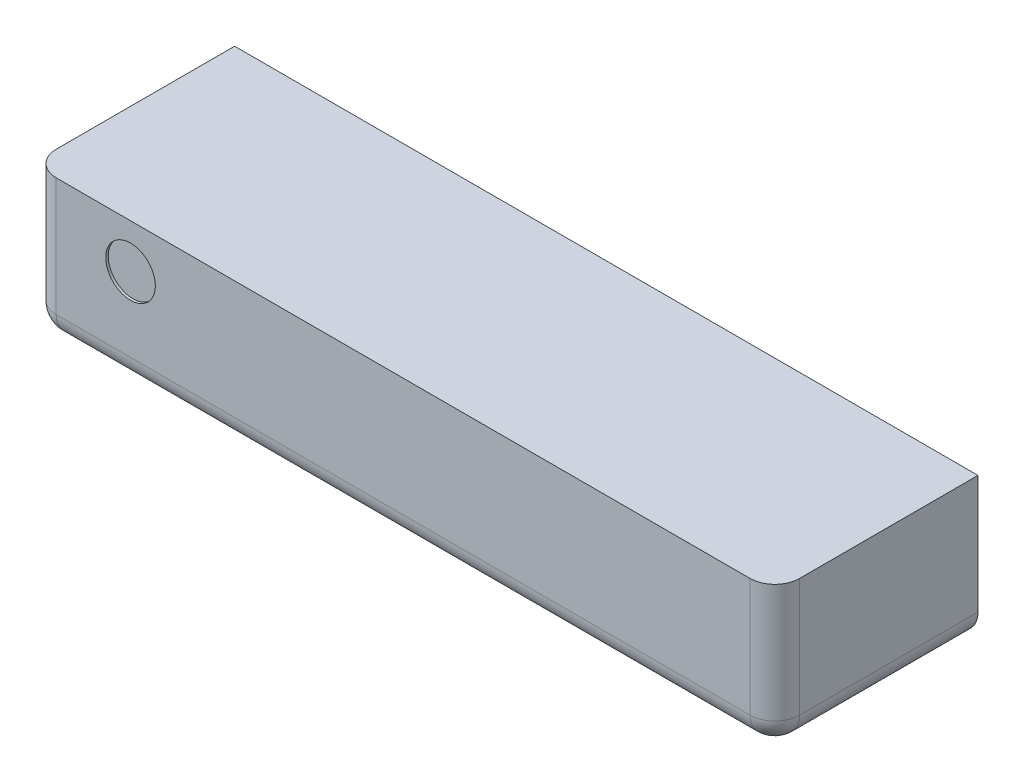
ISO-10303-21;
HEADER;
FILE_DESCRIPTION(('STEP AP214'),'2;1');
FILE_NAME('part.step','',(''),(''),'','','');
FILE_SCHEMA(('AUTOMOTIVE_DESIGN { 1 0 10303 214 1 1 1 1 }'));
ENDSEC;
DATA;
#1=APPLICATION_CONTEXT('core data for automotive mechanical design processes');
#2=APPLICATION_PROTOCOL_DEFINITION('international standard','automotive_design',2000,#1);
#3=PRODUCT_CONTEXT('',#1,'mechanical');
#4=PRODUCT('Part','Part','',(#3));
#5=PRODUCT_RELATED_PRODUCT_CATEGORY('part','',(#4));
#6=PRODUCT_DEFINITION_FORMATION('','',#4);
#7=PRODUCT_DEFINITION_CONTEXT('part definition',#1,'design');
#8=PRODUCT_DEFINITION('design','',#6,#7);
#9=PRODUCT_DEFINITION_SHAPE('','',#8);
#10=(LENGTH_UNIT() NAMED_UNIT(*) SI_UNIT(.MILLI.,.METRE.));
#11=(NAMED_UNIT(*) PLANE_ANGLE_UNIT() SI_UNIT($,.RADIAN.));
#12=(NAMED_UNIT(*) SI_UNIT($,.STERADIAN.) SOLID_ANGLE_UNIT());
#13=UNCERTAINTY_MEASURE_WITH_UNIT(LENGTH_MEASURE(1.E-05),#10,'distance_accuracy_value','');
#14=(GEOMETRIC_REPRESENTATION_CONTEXT(3) GLOBAL_UNCERTAINTY_ASSIGNED_CONTEXT((#13)) GLOBAL_UNIT_ASSIGNED_CONTEXT((#10,
#11,#12)) REPRESENTATION_CONTEXT('',''));
#15=CARTESIAN_POINT('',(0.,0.,0.));
#16=DIRECTION('',(0.,0.,1.));
#17=DIRECTION('',(1.,0.,0.));
#18=AXIS2_PLACEMENT_3D('',#15,#16,#17);
#19=CARTESIAN_POINT('',(-1.125,-1.51,0.2));
#20=DIRECTION('',(1.,0.,0.));
#21=DIRECTION('',(0.,1.,0.));
#22=AXIS2_PLACEMENT_3D('',#19,#20,#21);
#23=PLANE('',#22);
#24=DIRECTION('',(0.,1.,0.));
#25=VECTOR('',#24,1.);
#26=CARTESIAN_POINT('',(-1.125,-1.51,0.));
#27=LINE('',#26,#25);
#28=CARTESIAN_POINT('',(-1.125,-1.51,0.));
#29=VERTEX_POINT('',#28);
#30=CARTESIAN_POINT('',(-1.125,-1.26,0.));
#31=VERTEX_POINT('',#30);
#32=EDGE_CURVE('P0_E89',#29,#31,#27,.T.);
#33=ORIENTED_EDGE('',*,*,#32,.F.);
#34=DIRECTION('',(0.,0.,-1.));
#35=VECTOR('',#34,1.);
#36=CARTESIAN_POINT('',(-1.125,-1.51,0.2));
#37=LINE('',#36,#35);
#38=CARTESIAN_POINT('',(-1.125,-1.51,0.2));
#39=VERTEX_POINT('',#38);
#40=EDGE_CURVE('P0_E76',#39,#29,#37,.T.);
#41=ORIENTED_EDGE('',*,*,#40,.F.);
#42=DIRECTION('',(0.,1.,0.));
#43=VECTOR('',#42,1.);
#44=CARTESIAN_POINT('',(-1.125,-1.51,0.2));
#45=LINE('',#44,#43);
#46=CARTESIAN_POINT('',(-1.125,-1.26,0.2));
#47=VERTEX_POINT('',#46);
#48=EDGE_CURVE('P0_E99',#39,#47,#45,.T.);
#49=ORIENTED_EDGE('',*,*,#48,.T.);
#50=DIRECTION('',(0.,0.,-1.));
#51=VECTOR('',#50,1.);
#52=CARTESIAN_POINT('',(-1.125,-1.26,0.2));
#53=LINE('',#52,#51);
#54=EDGE_CURVE('P0_E11',#47,#31,#53,.T.);
#55=ORIENTED_EDGE('',*,*,#54,.T.);
#56=EDGE_LOOP('',(#33,#41,#49,#55));
#57=FACE_BOUND('',#56,.T.);
#58=ADVANCED_FACE('P0_F17',(#57),#23,.F.);
#59=CARTESIAN_POINT('',(-0.975,-1.26,0.2));
#60=DIRECTION('',(0.,0.,-1.));
#61=DIRECTION('',(-1.,0.,0.));
#62=AXIS2_PLACEMENT_3D('',#59,#60,#61);
#63=CYLINDRICAL_SURFACE('',#62,0.15);
#64=CARTESIAN_POINT('',(-0.975,-1.26,0.));
#65=DIRECTION('',(0.,0.,-1.));
#66=DIRECTION('',(1.,0.,0.));
#67=AXIS2_PLACEMENT_3D('',#64,#65,#66);
#68=CIRCLE('',#67,0.15);
#69=CARTESIAN_POINT('',(-0.825,-1.26,0.));
#70=VERTEX_POINT('',#69);
#71=EDGE_CURVE('P0_E70',#31,#70,#68,.T.);
#72=ORIENTED_EDGE('',*,*,#71,.F.);
#73=ORIENTED_EDGE('',*,*,#54,.F.);
#74=CARTESIAN_POINT('',(-0.975,-1.26,0.2));
#75=DIRECTION('',(0.,0.,-1.));
#76=DIRECTION('',(1.,0.,0.));
#77=AXIS2_PLACEMENT_3D('',#74,#75,#76);
#78=CIRCLE('',#77,0.15);
#79=CARTESIAN_POINT('',(-0.825,-1.26,0.2));
#80=VERTEX_POINT('',#79);
#81=EDGE_CURVE('P0_E73',#47,#80,#78,.T.);
#82=ORIENTED_EDGE('',*,*,#81,.T.);
#83=DIRECTION('',(0.,0.,-1.));
#84=VECTOR('',#83,1.);
#85=CARTESIAN_POINT('',(-0.825,-1.26,0.2));
#86=LINE('',#85,#84);
#87=EDGE_CURVE('P0_E27',#80,#70,#86,.T.);
#88=ORIENTED_EDGE('',*,*,#87,.T.);
#89=EDGE_LOOP('',(#72,#73,#82,#88));
#90=FACE_BOUND('',#89,.T.);
#91=ADVANCED_FACE('P0_F67',(#90),#63,.T.);
#92=CARTESIAN_POINT('',(-0.825,-1.51,0.2));
#93=DIRECTION('',(-1.,0.,0.));
#94=DIRECTION('',(0.,0.,1.));
#95=AXIS2_PLACEMENT_3D('',#92,#93,#94);
#96=PLANE('',#95);
#97=DIRECTION('',(0.,-1.,0.));
#98=VECTOR('',#97,1.);
#99=CARTESIAN_POINT('',(-0.825,-1.51,0.));
#100=LINE('',#99,#98);
#101=CARTESIAN_POINT('',(-0.825,-1.51,0.));
#102=VERTEX_POINT('',#101);
#103=EDGE_CURVE('P0_E79',#70,#102,#100,.T.);
#104=ORIENTED_EDGE('',*,*,#103,.F.);
#105=ORIENTED_EDGE('',*,*,#87,.F.);
#106=DIRECTION('',(0.,-1.,0.));
#107=VECTOR('',#106,1.);
#108=CARTESIAN_POINT('',(-0.825,-1.51,0.2));
#109=LINE('',#108,#107);
#110=CARTESIAN_POINT('',(-0.825,-1.51,0.2));
#111=VERTEX_POINT('',#110);
#112=EDGE_CURVE('P0_E109',#80,#111,#109,.T.);
#113=ORIENTED_EDGE('',*,*,#112,.T.);
#114=DIRECTION('',(0.,0.,-1.));
#115=VECTOR('',#114,1.);
#116=CARTESIAN_POINT('',(-0.825,-1.51,0.2));
#117=LINE('',#116,#115);
#118=EDGE_CURVE('P0_E20',#111,#102,#117,.T.);
#119=ORIENTED_EDGE('',*,*,#118,.T.);
#120=EDGE_LOOP('',(#104,#105,#113,#119));
#121=FACE_BOUND('',#120,.T.);
#122=ADVANCED_FACE('P0_F80',(#121),#96,.F.);
#123=CARTESIAN_POINT('',(-1.125,-1.51,0.2));
#124=DIRECTION('',(0.,1.,0.));
#125=DIRECTION('',(1.,0.,0.));
#126=AXIS2_PLACEMENT_3D('',#123,#124,#125);
#127=PLANE('',#126);
#128=DIRECTION('',(-1.,0.,0.));
#129=VECTOR('',#128,1.);
#130=CARTESIAN_POINT('',(-1.125,-1.51,0.));
#131=LINE('',#130,#129);
#132=EDGE_CURVE('P0_E85',#102,#29,#131,.T.);
#133=ORIENTED_EDGE('',*,*,#132,.F.);
#134=ORIENTED_EDGE('',*,*,#118,.F.);
#135=DIRECTION('',(-1.,0.,0.));
#136=VECTOR('',#135,1.);
#137=CARTESIAN_POINT('',(-1.125,-1.51,0.2));
#138=LINE('',#137,#136);
#139=EDGE_CURVE('P0_E105',#111,#39,#138,.T.);
#140=ORIENTED_EDGE('',*,*,#139,.T.);
#141=ORIENTED_EDGE('',*,*,#40,.T.);
#142=EDGE_LOOP('',(#133,#134,#140,#141));
#143=FACE_BOUND('',#142,.T.);
#144=ADVANCED_FACE('P0_F123',(#143),#127,.F.);
#145=CARTESIAN_POINT('',(-0.975,-1.26,0.2));
#146=DIRECTION('',(0.,0.,1.));
#147=DIRECTION('',(1.,0.,0.));
#148=AXIS2_PLACEMENT_3D('',#145,#146,#147);
#149=PLANE('',#148);
#150=ORIENTED_EDGE('',*,*,#48,.F.);
#151=ORIENTED_EDGE('',*,*,#139,.F.);
#152=ORIENTED_EDGE('',*,*,#112,.F.);
#153=ORIENTED_EDGE('',*,*,#81,.F.);
#154=EDGE_LOOP('',(#150,#151,#152,#153));
#155=FACE_BOUND('',#154,.T.);
#156=ADVANCED_FACE('P0_F128',(#155),#149,.T.);
#157=CARTESIAN_POINT('',(-0.975,-1.26,0.));
#158=DIRECTION('',(0.,0.,1.));
#159=DIRECTION('',(1.,0.,0.));
#160=AXIS2_PLACEMENT_3D('',#157,#158,#159);
#161=PLANE('',#160);
#162=ORIENTED_EDGE('',*,*,#32,.T.);
#163=ORIENTED_EDGE('',*,*,#71,.T.);
#164=ORIENTED_EDGE('',*,*,#103,.T.);
#165=ORIENTED_EDGE('',*,*,#132,.T.);
#166=EDGE_LOOP('',(#162,#163,#164,#165));
#167=FACE_BOUND('',#166,.T.);
#168=ADVANCED_FACE('P0_F87',(#167),#161,.F.);
#169=CLOSED_SHELL('',(#58,#91,#122,#144,#156,#168));
#170=MANIFOLD_SOLID_BREP('P0_B1',#169);
#171=CARTESIAN_POINT('',(-0.475,-1.51,0.2));
#172=DIRECTION('',(1.,0.,0.));
#173=DIRECTION('',(0.,1.,0.));
#174=AXIS2_PLACEMENT_3D('',#171,#172,#173);
#175=PLANE('',#174);
#176=DIRECTION('',(0.,1.,0.));
#177=VECTOR('',#176,1.);
#178=CARTESIAN_POINT('',(-0.475,-1.51,0.));
#179=LINE('',#178,#177);
#180=CARTESIAN_POINT('',(-0.475,-1.51,0.));
#181=VERTEX_POINT('',#180);
#182=CARTESIAN_POINT('',(-0.475,-1.26,0.));
#183=VERTEX_POINT('',#182);
#184=EDGE_CURVE('P1_E88',#181,#183,#179,.T.);
#185=ORIENTED_EDGE('',*,*,#184,.F.);
#186=DIRECTION('',(0.,0.,-1.));
#187=VECTOR('',#186,1.);
#188=CARTESIAN_POINT('',(-0.475,-1.51,0.2));
#189=LINE('',#188,#187);
#190=CARTESIAN_POINT('',(-0.475,-1.51,0.2));
#191=VERTEX_POINT('',#190);
#192=EDGE_CURVE('P1_E71',#191,#181,#189,.T.);
#193=ORIENTED_EDGE('',*,*,#192,.F.);
#194=DIRECTION('',(0.,1.,0.));
#195=VECTOR('',#194,1.);
#196=CARTESIAN_POINT('',(-0.475,-1.51,0.2));
#197=LINE('',#196,#195);
#198=CARTESIAN_POINT('',(-0.475,-1.26,0.2));
#199=VERTEX_POINT('',#198);
#200=EDGE_CURVE('P1_E91',#191,#199,#197,.T.);
#201=ORIENTED_EDGE('',*,*,#200,.T.);
#202=DIRECTION('',(0.,0.,-1.));
#203=VECTOR('',#202,1.);
#204=CARTESIAN_POINT('',(-0.475,-1.26,0.2));
#205=LINE('',#204,#203);
#206=EDGE_CURVE('P1_E11',#199,#183,#205,.T.);
#207=ORIENTED_EDGE('',*,*,#206,.T.);
#208=EDGE_LOOP('',(#185,#193,#201,#207));
#209=FACE_BOUND('',#208,.T.);
#210=ADVANCED_FACE('P1_F17',(#209),#175,.F.);
#211=CARTESIAN_POINT('',(-0.325,-1.26,0.2));
#212=DIRECTION('',(0.,0.,-1.));
#213=DIRECTION('',(-1.,0.,0.));
#214=AXIS2_PLACEMENT_3D('',#211,#212,#213);
#215=CYLINDRICAL_SURFACE('',#214,0.15);
#216=CARTESIAN_POINT('',(-0.325,-1.26,0.));
#217=DIRECTION('',(0.,0.,-1.));
#218=DIRECTION('',(1.,0.,0.));
#219=AXIS2_PLACEMENT_3D('',#216,#217,#218);
#220=CIRCLE('',#219,0.15);
#221=CARTESIAN_POINT('',(-0.175,-1.26,0.));
#222=VERTEX_POINT('',#221);
#223=EDGE_CURVE('P1_E95',#183,#222,#220,.T.);
#224=ORIENTED_EDGE('',*,*,#223,.F.);
#225=ORIENTED_EDGE('',*,*,#206,.F.);
#226=CARTESIAN_POINT('',(-0.325,-1.26,0.2));
#227=DIRECTION('',(0.,0.,-1.));
#228=DIRECTION('',(1.,0.,0.));
#229=AXIS2_PLACEMENT_3D('',#226,#227,#228);
#230=CIRCLE('',#229,0.15);
#231=CARTESIAN_POINT('',(-0.175,-1.26,0.2));
#232=VERTEX_POINT('',#231);
#233=EDGE_CURVE('P1_E113',#199,#232,#230,.T.);
#234=ORIENTED_EDGE('',*,*,#233,.T.);
#235=DIRECTION('',(0.,0.,-1.));
#236=VECTOR('',#235,1.);
#237=CARTESIAN_POINT('',(-0.175,-1.26,0.2));
#238=LINE('',#237,#236);
#239=EDGE_CURVE('P1_E25',#232,#222,#238,.T.);
#240=ORIENTED_EDGE('',*,*,#239,.T.);
#241=EDGE_LOOP('',(#224,#225,#234,#240));
#242=FACE_BOUND('',#241,.T.);
#243=ADVANCED_FACE('P1_F124',(#242),#215,.T.);
#244=CARTESIAN_POINT('',(-0.175,-1.51,0.2));
#245=DIRECTION('',(-1.,0.,0.));
#246=DIRECTION('',(0.,0.,1.));
#247=AXIS2_PLACEMENT_3D('',#244,#245,#246);
#248=PLANE('',#247);
#249=DIRECTION('',(0.,-1.,0.));
#250=VECTOR('',#249,1.);
#251=CARTESIAN_POINT('',(-0.175,-1.51,0.));
#252=LINE('',#251,#250);
#253=CARTESIAN_POINT('',(-0.175,-1.51,0.));
#254=VERTEX_POINT('',#253);
#255=EDGE_CURVE('P1_E89',#222,#254,#252,.T.);
#256=ORIENTED_EDGE('',*,*,#255,.F.);
#257=ORIENTED_EDGE('',*,*,#239,.F.);
#258=DIRECTION('',(0.,-1.,0.));
#259=VECTOR('',#258,1.);
#260=CARTESIAN_POINT('',(-0.175,-1.51,0.2));
#261=LINE('',#260,#259);
#262=CARTESIAN_POINT('',(-0.175,-1.51,0.2));
#263=VERTEX_POINT('',#262);
#264=EDGE_CURVE('P1_E110',#232,#263,#261,.T.);
#265=ORIENTED_EDGE('',*,*,#264,.T.);
#266=DIRECTION('',(0.,0.,-1.));
#267=VECTOR('',#266,1.);
#268=CARTESIAN_POINT('',(-0.175,-1.51,0.2));
#269=LINE('',#268,#267);
#270=EDGE_CURVE('P1_E48',#263,#254,#269,.T.);
#271=ORIENTED_EDGE('',*,*,#270,.T.);
#272=EDGE_LOOP('',(#256,#257,#265,#271));
#273=FACE_BOUND('',#272,.T.);
#274=ADVANCED_FACE('P1_F118',(#273),#248,.F.);
#275=CARTESIAN_POINT('',(-0.475,-1.51,0.2));
#276=DIRECTION('',(0.,1.,0.));
#277=DIRECTION('',(1.,0.,0.));
#278=AXIS2_PLACEMENT_3D('',#275,#276,#277);
#279=PLANE('',#278);
#280=DIRECTION('',(-1.,0.,0.));
#281=VECTOR('',#280,1.);
#282=CARTESIAN_POINT('',(-0.475,-1.51,0.));
#283=LINE('',#282,#281);
#284=EDGE_CURVE('P1_E74',#254,#181,#283,.T.);
#285=ORIENTED_EDGE('',*,*,#284,.F.);
#286=ORIENTED_EDGE('',*,*,#270,.F.);
#287=DIRECTION('',(-1.,0.,0.));
#288=VECTOR('',#287,1.);
#289=CARTESIAN_POINT('',(-0.475,-1.51,0.2));
#290=LINE('',#289,#288);
#291=EDGE_CURVE('P1_E77',#263,#191,#290,.T.);
#292=ORIENTED_EDGE('',*,*,#291,.T.);
#293=ORIENTED_EDGE('',*,*,#192,.T.);
#294=EDGE_LOOP('',(#285,#286,#292,#293));
#295=FACE_BOUND('',#294,.T.);
#296=ADVANCED_FACE('P1_F73',(#295),#279,.F.);
#297=CARTESIAN_POINT('',(-0.325,-1.26,0.2));
#298=DIRECTION('',(0.,0.,1.));
#299=DIRECTION('',(1.,0.,0.));
#300=AXIS2_PLACEMENT_3D('',#297,#298,#299);
#301=PLANE('',#300);
#302=ORIENTED_EDGE('',*,*,#200,.F.);
#303=ORIENTED_EDGE('',*,*,#291,.F.);
#304=ORIENTED_EDGE('',*,*,#264,.F.);
#305=ORIENTED_EDGE('',*,*,#233,.F.);
#306=EDGE_LOOP('',(#302,#303,#304,#305));
#307=FACE_BOUND('',#306,.T.);
#308=ADVANCED_FACE('P1_F122',(#307),#301,.T.);
#309=CARTESIAN_POINT('',(-0.325,-1.26,0.));
#310=DIRECTION('',(0.,0.,1.));
#311=DIRECTION('',(1.,0.,0.));
#312=AXIS2_PLACEMENT_3D('',#309,#310,#311);
#313=PLANE('',#312);
#314=ORIENTED_EDGE('',*,*,#184,.T.);
#315=ORIENTED_EDGE('',*,*,#223,.T.);
#316=ORIENTED_EDGE('',*,*,#255,.T.);
#317=ORIENTED_EDGE('',*,*,#284,.T.);
#318=EDGE_LOOP('',(#314,#315,#316,#317));
#319=FACE_BOUND('',#318,.T.);
#320=ADVANCED_FACE('P1_F86',(#319),#313,.F.);
#321=CLOSED_SHELL('',(#210,#243,#274,#296,#308,#320));
#322=MANIFOLD_SOLID_BREP('P1_B1',#321);
#323=CARTESIAN_POINT('',(0.475,-1.51,0.2));
#324=DIRECTION('',(-1.,0.,0.));
#325=DIRECTION('',(0.,0.,1.));
#326=AXIS2_PLACEMENT_3D('',#323,#324,#325);
#327=PLANE('',#326);
#328=DIRECTION('',(0.,1.,0.));
#329=VECTOR('',#328,1.);
#330=CARTESIAN_POINT('',(0.475,-1.51,0.));
#331=LINE('',#330,#329);
#332=CARTESIAN_POINT('',(0.475,-1.51,0.));
#333=VERTEX_POINT('',#332);
#334=CARTESIAN_POINT('',(0.475,-1.26,0.));
#335=VERTEX_POINT('',#334);
#336=EDGE_CURVE('P2_E72',#333,#335,#331,.T.);
#337=ORIENTED_EDGE('',*,*,#336,.T.);
#338=DIRECTION('',(0.,0.,-1.));
#339=VECTOR('',#338,1.);
#340=CARTESIAN_POINT('',(0.475,-1.26,0.2));
#341=LINE('',#340,#339);
#342=CARTESIAN_POINT('',(0.475,-1.26,0.2));
#343=VERTEX_POINT('',#342);
#344=EDGE_CURVE('P2_E11',#343,#335,#341,.T.);
#345=ORIENTED_EDGE('',*,*,#344,.F.);
#346=DIRECTION('',(0.,1.,0.));
#347=VECTOR('',#346,1.);
#348=CARTESIAN_POINT('',(0.475,-1.51,0.2));
#349=LINE('',#348,#347);
#350=CARTESIAN_POINT('',(0.475,-1.51,0.2));
#351=VERTEX_POINT('',#350);
#352=EDGE_CURVE('P2_E74',#351,#343,#349,.T.);
#353=ORIENTED_EDGE('',*,*,#352,.F.);
#354=DIRECTION('',(0.,0.,-1.));
#355=VECTOR('',#354,1.);
#356=CARTESIAN_POINT('',(0.475,-1.51,0.2));
#357=LINE('',#356,#355);
#358=EDGE_CURVE('P2_E68',#351,#333,#357,.T.);
#359=ORIENTED_EDGE('',*,*,#358,.T.);
#360=EDGE_LOOP('',(#337,#345,#353,#359));
#361=FACE_BOUND('',#360,.T.);
#362=ADVANCED_FACE('P2_F17',(#361),#327,.F.);
#363=CARTESIAN_POINT('',(0.325,-1.26,0.2));
#364=DIRECTION('',(0.,0.,-1.));
#365=DIRECTION('',(1.,0.,0.));
#366=AXIS2_PLACEMENT_3D('',#363,#364,#365);
#367=CYLINDRICAL_SURFACE('',#366,0.15);
#368=CARTESIAN_POINT('',(0.325,-1.26,0.));
#369=DIRECTION('',(0.,0.,1.));
#370=DIRECTION('',(-1.,0.,0.));
#371=AXIS2_PLACEMENT_3D('',#368,#369,#370);
#372=CIRCLE('',#371,0.15);
#373=CARTESIAN_POINT('',(0.175,-1.26,0.));
#374=VERTEX_POINT('',#373);
#375=EDGE_CURVE('P2_E91',#335,#374,#372,.T.);
#376=ORIENTED_EDGE('',*,*,#375,.T.);
#377=DIRECTION('',(0.,0.,-1.));
#378=VECTOR('',#377,1.);
#379=CARTESIAN_POINT('',(0.175,-1.26,0.2));
#380=LINE('',#379,#378);
#381=CARTESIAN_POINT('',(0.175,-1.26,0.2));
#382=VERTEX_POINT('',#381);
#383=EDGE_CURVE('P2_E27',#382,#374,#380,.T.);
#384=ORIENTED_EDGE('',*,*,#383,.F.);
#385=CARTESIAN_POINT('',(0.325,-1.26,0.2));
#386=DIRECTION('',(0.,0.,1.));
#387=DIRECTION('',(-1.,0.,0.));
#388=AXIS2_PLACEMENT_3D('',#385,#386,#387);
#389=CIRCLE('',#388,0.15);
#390=EDGE_CURVE('P2_E103',#343,#382,#389,.T.);
#391=ORIENTED_EDGE('',*,*,#390,.F.);
#392=ORIENTED_EDGE('',*,*,#344,.T.);
#393=EDGE_LOOP('',(#376,#384,#391,#392));
#394=FACE_BOUND('',#393,.T.);
#395=ADVANCED_FACE('P2_F19',(#394),#367,.T.);
#396=CARTESIAN_POINT('',(0.175,-1.51,0.2));
#397=DIRECTION('',(1.,0.,0.));
#398=DIRECTION('',(0.,1.,0.));
#399=AXIS2_PLACEMENT_3D('',#396,#397,#398);
#400=PLANE('',#399);
#401=DIRECTION('',(0.,-1.,0.));
#402=VECTOR('',#401,1.);
#403=CARTESIAN_POINT('',(0.175,-1.51,0.));
#404=LINE('',#403,#402);
#405=CARTESIAN_POINT('',(0.175,-1.51,0.));
#406=VERTEX_POINT('',#405);
#407=EDGE_CURVE('P2_E86',#374,#406,#404,.T.);
#408=ORIENTED_EDGE('',*,*,#407,.T.);
#409=DIRECTION('',(0.,0.,-1.));
#410=VECTOR('',#409,1.);
#411=CARTESIAN_POINT('',(0.175,-1.51,0.2));
#412=LINE('',#411,#410);
#413=CARTESIAN_POINT('',(0.175,-1.51,0.2));
#414=VERTEX_POINT('',#413);
#415=EDGE_CURVE('P2_E40',#414,#406,#412,.T.);
#416=ORIENTED_EDGE('',*,*,#415,.F.);
#417=DIRECTION('',(0.,-1.,0.));
#418=VECTOR('',#417,1.);
#419=CARTESIAN_POINT('',(0.175,-1.51,0.2));
#420=LINE('',#419,#418);
#421=EDGE_CURVE('P2_E107',#382,#414,#420,.T.);
#422=ORIENTED_EDGE('',*,*,#421,.F.);
#423=ORIENTED_EDGE('',*,*,#383,.T.);
#424=EDGE_LOOP('',(#408,#416,#422,#423));
#425=FACE_BOUND('',#424,.T.);
#426=ADVANCED_FACE('P2_F120',(#425),#400,.F.);
#427=CARTESIAN_POINT('',(0.475,-1.51,0.2));
#428=DIRECTION('',(0.,1.,0.));
#429=DIRECTION('',(1.,0.,0.));
#430=AXIS2_PLACEMENT_3D('',#427,#428,#429);
#431=PLANE('',#430);
#432=DIRECTION('',(1.,0.,0.));
#433=VECTOR('',#432,1.);
#434=CARTESIAN_POINT('',(0.475,-1.51,0.));
#435=LINE('',#434,#433);
#436=EDGE_CURVE('P2_E81',#406,#333,#435,.T.);
#437=ORIENTED_EDGE('',*,*,#436,.T.);
#438=ORIENTED_EDGE('',*,*,#358,.F.);
#439=DIRECTION('',(1.,0.,0.));
#440=VECTOR('',#439,1.);
#441=CARTESIAN_POINT('',(0.475,-1.51,0.2));
#442=LINE('',#441,#440);
#443=EDGE_CURVE('P2_E78',#414,#351,#442,.T.);
#444=ORIENTED_EDGE('',*,*,#443,.F.);
#445=ORIENTED_EDGE('',*,*,#415,.T.);
#446=EDGE_LOOP('',(#437,#438,#444,#445));
#447=FACE_BOUND('',#446,.T.);
#448=ADVANCED_FACE('P2_F82',(#447),#431,.F.);
#449=CARTESIAN_POINT('',(0.325,-1.26,0.2));
#450=DIRECTION('',(0.,0.,1.));
#451=DIRECTION('',(1.,0.,0.));
#452=AXIS2_PLACEMENT_3D('',#449,#450,#451);
#453=PLANE('',#452);
#454=ORIENTED_EDGE('',*,*,#352,.T.);
#455=ORIENTED_EDGE('',*,*,#390,.T.);
#456=ORIENTED_EDGE('',*,*,#421,.T.);
#457=ORIENTED_EDGE('',*,*,#443,.T.);
#458=EDGE_LOOP('',(#454,#455,#456,#457));
#459=FACE_BOUND('',#458,.T.);
#460=ADVANCED_FACE('P2_F118',(#459),#453,.T.);
#461=CARTESIAN_POINT('',(0.325,-1.26,0.));
#462=DIRECTION('',(0.,0.,1.));
#463=DIRECTION('',(1.,0.,0.));
#464=AXIS2_PLACEMENT_3D('',#461,#462,#463);
#465=PLANE('',#464);
#466=ORIENTED_EDGE('',*,*,#336,.F.);
#467=ORIENTED_EDGE('',*,*,#436,.F.);
#468=ORIENTED_EDGE('',*,*,#407,.F.);
#469=ORIENTED_EDGE('',*,*,#375,.F.);
#470=EDGE_LOOP('',(#466,#467,#468,#469));
#471=FACE_BOUND('',#470,.T.);
#472=ADVANCED_FACE('P2_F89',(#471),#465,.F.);
#473=CLOSED_SHELL('',(#362,#395,#426,#448,#460,#472));
#474=MANIFOLD_SOLID_BREP('P2_B1',#473);
#475=CARTESIAN_POINT('',(1.125,-1.51,0.2));
#476=DIRECTION('',(-1.,0.,0.));
#477=DIRECTION('',(0.,0.,1.));
#478=AXIS2_PLACEMENT_3D('',#475,#476,#477);
#479=PLANE('',#478);
#480=DIRECTION('',(0.,1.,0.));
#481=VECTOR('',#480,1.);
#482=CARTESIAN_POINT('',(1.125,-1.51,0.));
#483=LINE('',#482,#481);
#484=CARTESIAN_POINT('',(1.125,-1.51,0.));
#485=VERTEX_POINT('',#484);
#486=CARTESIAN_POINT('',(1.125,-1.26,0.));
#487=VERTEX_POINT('',#486);
#488=EDGE_CURVE('P3_E77',#485,#487,#483,.T.);
#489=ORIENTED_EDGE('',*,*,#488,.T.);
#490=DIRECTION('',(0.,0.,-1.));
#491=VECTOR('',#490,1.);
#492=CARTESIAN_POINT('',(1.125,-1.26,0.2));
#493=LINE('',#492,#491);
#494=CARTESIAN_POINT('',(1.125,-1.26,0.2));
#495=VERTEX_POINT('',#494);
#496=EDGE_CURVE('P3_E11',#495,#487,#493,.T.);
#497=ORIENTED_EDGE('',*,*,#496,.F.);
#498=DIRECTION('',(0.,1.,0.));
#499=VECTOR('',#498,1.);
#500=CARTESIAN_POINT('',(1.125,-1.51,0.2));
#501=LINE('',#500,#499);
#502=CARTESIAN_POINT('',(1.125,-1.51,0.2));
#503=VERTEX_POINT('',#502);
#504=EDGE_CURVE('P3_E79',#503,#495,#501,.T.);
#505=ORIENTED_EDGE('',*,*,#504,.F.);
#506=DIRECTION('',(0.,0.,-1.));
#507=VECTOR('',#506,1.);
#508=CARTESIAN_POINT('',(1.125,-1.51,0.2));
#509=LINE('',#508,#507);
#510=EDGE_CURVE('P3_E74',#503,#485,#509,.T.);
#511=ORIENTED_EDGE('',*,*,#510,.T.);
#512=EDGE_LOOP('',(#489,#497,#505,#511));
#513=FACE_BOUND('',#512,.T.);
#514=ADVANCED_FACE('P3_F17',(#513),#479,.F.);
#515=CARTESIAN_POINT('',(0.975,-1.26,0.2));
#516=DIRECTION('',(0.,0.,-1.));
#517=DIRECTION('',(1.,0.,0.));
#518=AXIS2_PLACEMENT_3D('',#515,#516,#517);
#519=CYLINDRICAL_SURFACE('',#518,0.15);
#520=CARTESIAN_POINT('',(0.975,-1.26,0.));
#521=DIRECTION('',(0.,0.,1.));
#522=DIRECTION('',(-1.,0.,0.));
#523=AXIS2_PLACEMENT_3D('',#520,#521,#522);
#524=CIRCLE('',#523,0.15);
#525=CARTESIAN_POINT('',(0.825,-1.26,0.));
#526=VERTEX_POINT('',#525);
#527=EDGE_CURVE('P3_E95',#487,#526,#524,.T.);
#528=ORIENTED_EDGE('',*,*,#527,.T.);
#529=DIRECTION('',(0.,0.,-1.));
#530=VECTOR('',#529,1.);
#531=CARTESIAN_POINT('',(0.825,-1.26,0.2));
#532=LINE('',#531,#530);
#533=CARTESIAN_POINT('',(0.825,-1.26,0.2));
#534=VERTEX_POINT('',#533);
#535=EDGE_CURVE('P3_E25',#534,#526,#532,.T.);
#536=ORIENTED_EDGE('',*,*,#535,.F.);
#537=CARTESIAN_POINT('',(0.975,-1.26,0.2));
#538=DIRECTION('',(0.,0.,1.));
#539=DIRECTION('',(-1.,0.,0.));
#540=AXIS2_PLACEMENT_3D('',#537,#538,#539);
#541=CIRCLE('',#540,0.15);
#542=EDGE_CURVE('P3_E114',#495,#534,#541,.T.);
#543=ORIENTED_EDGE('',*,*,#542,.F.);
#544=ORIENTED_EDGE('',*,*,#496,.T.);
#545=EDGE_LOOP('',(#528,#536,#543,#544));
#546=FACE_BOUND('',#545,.T.);
#547=ADVANCED_FACE('P3_F124',(#546),#519,.T.);
#548=CARTESIAN_POINT('',(0.825,-1.51,0.2));
#549=DIRECTION('',(1.,0.,0.));
#550=DIRECTION('',(0.,1.,0.));
#551=AXIS2_PLACEMENT_3D('',#548,#549,#550);
#552=PLANE('',#551);
#553=DIRECTION('',(0.,-1.,0.));
#554=VECTOR('',#553,1.);
#555=CARTESIAN_POINT('',(0.825,-1.51,0.));
#556=LINE('',#555,#554);
#557=CARTESIAN_POINT('',(0.825,-1.51,0.));
#558=VERTEX_POINT('',#557);
#559=EDGE_CURVE('P3_E91',#526,#558,#556,.T.);
#560=ORIENTED_EDGE('',*,*,#559,.T.);
#561=DIRECTION('',(0.,0.,-1.));
#562=VECTOR('',#561,1.);
#563=CARTESIAN_POINT('',(0.825,-1.51,0.2));
#564=LINE('',#563,#562);
#565=CARTESIAN_POINT('',(0.825,-1.51,0.2));
#566=VERTEX_POINT('',#565);
#567=EDGE_CURVE('P3_E38',#566,#558,#564,.T.);
#568=ORIENTED_EDGE('',*,*,#567,.F.);
#569=DIRECTION('',(0.,-1.,0.));
#570=VECTOR('',#569,1.);
#571=CARTESIAN_POINT('',(0.825,-1.51,0.2));
#572=LINE('',#571,#570);
#573=EDGE_CURVE('P3_E105',#534,#566,#572,.T.);
#574=ORIENTED_EDGE('',*,*,#573,.F.);
#575=ORIENTED_EDGE('',*,*,#535,.T.);
#576=EDGE_LOOP('',(#560,#568,#574,#575));
#577=FACE_BOUND('',#576,.T.);
#578=ADVANCED_FACE('P3_F123',(#577),#552,.F.);
#579=CARTESIAN_POINT('',(1.125,-1.51,0.2));
#580=DIRECTION('',(0.,1.,0.));
#581=DIRECTION('',(1.,0.,0.));
#582=AXIS2_PLACEMENT_3D('',#579,#580,#581);
#583=PLANE('',#582);
#584=DIRECTION('',(1.,0.,0.));
#585=VECTOR('',#584,1.);
#586=CARTESIAN_POINT('',(1.125,-1.51,0.));
#587=LINE('',#586,#585);
#588=EDGE_CURVE('P3_E86',#558,#485,#587,.T.);
#589=ORIENTED_EDGE('',*,*,#588,.T.);
#590=ORIENTED_EDGE('',*,*,#510,.F.);
#591=DIRECTION('',(1.,0.,0.));
#592=VECTOR('',#591,1.);
#593=CARTESIAN_POINT('',(1.125,-1.51,0.2));
#594=LINE('',#593,#592);
#595=EDGE_CURVE('P3_E83',#566,#503,#594,.T.);
#596=ORIENTED_EDGE('',*,*,#595,.F.);
#597=ORIENTED_EDGE('',*,*,#567,.T.);
#598=EDGE_LOOP('',(#589,#590,#596,#597));
#599=FACE_BOUND('',#598,.T.);
#600=ADVANCED_FACE('P3_F87',(#599),#583,.F.);
#601=CARTESIAN_POINT('',(0.975,-1.26,0.2));
#602=DIRECTION('',(0.,0.,1.));
#603=DIRECTION('',(1.,0.,0.));
#604=AXIS2_PLACEMENT_3D('',#601,#602,#603);
#605=PLANE('',#604);
#606=ORIENTED_EDGE('',*,*,#504,.T.);
#607=ORIENTED_EDGE('',*,*,#542,.T.);
#608=ORIENTED_EDGE('',*,*,#573,.T.);
#609=ORIENTED_EDGE('',*,*,#595,.T.);
#610=EDGE_LOOP('',(#606,#607,#608,#609));
#611=FACE_BOUND('',#610,.T.);
#612=ADVANCED_FACE('P3_F122',(#611),#605,.T.);
#613=CARTESIAN_POINT('',(0.975,-1.26,0.));
#614=DIRECTION('',(0.,0.,1.));
#615=DIRECTION('',(1.,0.,0.));
#616=AXIS2_PLACEMENT_3D('',#613,#614,#615);
#617=PLANE('',#616);
#618=ORIENTED_EDGE('',*,*,#488,.F.);
#619=ORIENTED_EDGE('',*,*,#588,.F.);
#620=ORIENTED_EDGE('',*,*,#559,.F.);
#621=ORIENTED_EDGE('',*,*,#527,.F.);
#622=EDGE_LOOP('',(#618,#619,#620,#621));
#623=FACE_BOUND('',#622,.T.);
#624=ADVANCED_FACE('P3_F94',(#623),#617,.F.);
#625=CLOSED_SHELL('',(#514,#547,#578,#600,#612,#624));
#626=MANIFOLD_SOLID_BREP('P3_B1',#625);
#627=CARTESIAN_POINT('',(13.302319024638,-0.922071728674461,5.39999695199399));
#628=DIRECTION('',(0.,-1.,0.));
#629=DIRECTION('',(0.,0.,-1.));
#630=AXIS2_PLACEMENT_3D('',#627,#628,#629);
#631=PLANE('',#630);
#632=DIRECTION('',(-1.,0.,0.));
#633=VECTOR('',#632,1.);
#634=CARTESIAN_POINT('',(0.,-0.922071728674461,0.03));
#635=LINE('',#634,#633);
#636=CARTESIAN_POINT('',(1.5,-0.922071728674461,0.03));
#637=VERTEX_POINT('',#636);
#638=CARTESIAN_POINT('',(-1.5,-0.922071728674461,0.03));
#639=VERTEX_POINT('',#638);
#640=EDGE_CURVE('P4_E25',#637,#639,#635,.T.);
#641=ORIENTED_EDGE('',*,*,#640,.T.);
#642=DIRECTION('',(0.,0.,-1.));
#643=VECTOR('',#642,1.);
#644=CARTESIAN_POINT('',(-1.5,-0.922071728674461,0.85));
#645=LINE('',#644,#643);
#646=CARTESIAN_POINT('',(-1.5,-0.922071728674461,0.75));
#647=VERTEX_POINT('',#646);
#648=EDGE_CURVE('P4_E123',#647,#639,#645,.T.);
#649=ORIENTED_EDGE('',*,*,#648,.F.);
#650=CARTESIAN_POINT('',(-1.4,-0.922071728674461,0.75));
#651=DIRECTION('',(0.,1.,0.));
#652=DIRECTION('',(0.,0.,-1.));
#653=AXIS2_PLACEMENT_3D('',#650,#651,#652);
#654=CIRCLE('',#653,0.1);
#655=CARTESIAN_POINT('',(-1.4,-0.922071728674461,0.85));
#656=VERTEX_POINT('',#655);
#657=EDGE_CURVE('P4_E114',#647,#656,#654,.T.);
#658=ORIENTED_EDGE('',*,*,#657,.T.);
#659=DIRECTION('',(-1.,0.,0.));
#660=VECTOR('',#659,1.);
#661=CARTESIAN_POINT('',(0.,-0.922071728674461,0.85));
#662=LINE('',#661,#660);
#663=CARTESIAN_POINT('',(1.4,-0.922071728674461,0.85));
#664=VERTEX_POINT('',#663);
#665=EDGE_CURVE('P4_E11',#664,#656,#662,.T.);
#666=ORIENTED_EDGE('',*,*,#665,.F.);
#667=CARTESIAN_POINT('',(1.4,-0.922071728674461,0.75));
#668=DIRECTION('',(0.,1.,0.));
#669=DIRECTION('',(0.,0.,-1.));
#670=AXIS2_PLACEMENT_3D('',#667,#668,#669);
#671=CIRCLE('',#670,0.1);
#672=CARTESIAN_POINT('',(1.5,-0.922071728674461,0.75));
#673=VERTEX_POINT('',#672);
#674=EDGE_CURVE('P4_E216',#664,#673,#671,.T.);
#675=ORIENTED_EDGE('',*,*,#674,.T.);
#676=DIRECTION('',(0.,0.,1.));
#677=VECTOR('',#676,1.);
#678=CARTESIAN_POINT('',(1.5,-0.922071728674461,0.85));
#679=LINE('',#678,#677);
#680=EDGE_CURVE('P4_E149',#637,#673,#679,.T.);
#681=ORIENTED_EDGE('',*,*,#680,.F.);
#682=EDGE_LOOP('',(#641,#649,#658,#666,#675,#681));
#683=FACE_BOUND('',#682,.T.);
#684=ADVANCED_FACE('P4_F17',(#683),#631,.F.);
#685=CARTESIAN_POINT('',(0.,0.,0.85));
#686=DIRECTION('',(0.,0.,-1.));
#687=DIRECTION('',(0.,-1.,0.));
#688=AXIS2_PLACEMENT_3D('',#685,#686,#687);
#689=PLANE('',#688);
#690=CARTESIAN_POINT('',(-1.1,-1.1,0.85));
#691=DIRECTION('',(0.,0.,1.));
#692=DIRECTION('',(-1.,0.,0.));
#693=AXIS2_PLACEMENT_3D('',#690,#691,#692);
#694=CIRCLE('',#693,0.1);
#695=CARTESIAN_POINT('',(-1.2,-1.1,0.85));
#696=VERTEX_POINT('',#695);
#697=EDGE_CURVE('P4_E450',#696,#696,#694,.T.);
#698=ORIENTED_EDGE('',*,*,#697,.F.);
#699=EDGE_LOOP('',(#698));
#700=FACE_BOUND('',#699,.T.);
#701=DIRECTION('',(0.,1.,0.));
#702=VECTOR('',#701,1.);
#703=CARTESIAN_POINT('',(1.4,0.,0.85));
#704=LINE('',#703,#702);
#705=CARTESIAN_POINT('',(1.4,-1.4,0.85));
#706=VERTEX_POINT('',#705);
#707=EDGE_CURVE('P4_E106',#706,#664,#704,.T.);
#708=ORIENTED_EDGE('',*,*,#707,.T.);
#709=ORIENTED_EDGE('',*,*,#665,.T.);
#710=DIRECTION('',(0.,-1.,0.));
#711=VECTOR('',#710,1.);
#712=CARTESIAN_POINT('',(-1.4,0.,0.85));
#713=LINE('',#712,#711);
#714=CARTESIAN_POINT('',(-1.4,-1.4,0.85));
#715=VERTEX_POINT('',#714);
#716=EDGE_CURVE('P4_E104',#656,#715,#713,.T.);
#717=ORIENTED_EDGE('',*,*,#716,.T.);
#718=DIRECTION('',(1.,0.,0.));
#719=VECTOR('',#718,1.);
#720=CARTESIAN_POINT('',(0.,-1.4,0.85));
#721=LINE('',#720,#719);
#722=EDGE_CURVE('P4_E203',#715,#706,#721,.T.);
#723=ORIENTED_EDGE('',*,*,#722,.T.);
#724=EDGE_LOOP('',(#708,#709,#717,#723));
#725=FACE_BOUND('',#724,.T.);
#726=ADVANCED_FACE('P4_F102',(#700,#725),#689,.F.);
#727=CARTESIAN_POINT('',(0.,0.,0.03));
#728=DIRECTION('',(0.,0.,-1.));
#729=DIRECTION('',(0.,-1.,0.));
#730=AXIS2_PLACEMENT_3D('',#727,#728,#729);
#731=PLANE('',#730);
#732=ORIENTED_EDGE('',*,*,#640,.F.);
#733=DIRECTION('',(0.,1.,0.));
#734=VECTOR('',#733,1.);
#735=CARTESIAN_POINT('',(1.5,-1.5,0.03));
#736=LINE('',#735,#734);
#737=CARTESIAN_POINT('',(1.5,-1.4,0.03));
#738=VERTEX_POINT('',#737);
#739=EDGE_CURVE('P4_E152',#738,#637,#736,.T.);
#740=ORIENTED_EDGE('',*,*,#739,.F.);
#741=CARTESIAN_POINT('',(1.4,-1.4,0.03));
#742=DIRECTION('',(0.,0.,-1.));
#743=DIRECTION('',(-1.,0.,0.));
#744=AXIS2_PLACEMENT_3D('',#741,#742,#743);
#745=CIRCLE('',#744,0.1);
#746=CARTESIAN_POINT('',(1.4,-1.5,0.03));
#747=VERTEX_POINT('',#746);
#748=EDGE_CURVE('P4_E170',#738,#747,#745,.T.);
#749=ORIENTED_EDGE('',*,*,#748,.T.);
#750=DIRECTION('',(1.,0.,0.));
#751=VECTOR('',#750,1.);
#752=CARTESIAN_POINT('',(-1.5,-1.5,0.03));
#753=LINE('',#752,#751);
#754=CARTESIAN_POINT('',(-1.4,-1.5,0.03));
#755=VERTEX_POINT('',#754);
#756=EDGE_CURVE('P4_E146',#755,#747,#753,.T.);
#757=ORIENTED_EDGE('',*,*,#756,.F.);
#758=CARTESIAN_POINT('',(-1.4,-1.4,0.03));
#759=DIRECTION('',(0.,0.,-1.));
#760=DIRECTION('',(-1.,0.,0.));
#761=AXIS2_PLACEMENT_3D('',#758,#759,#760);
#762=CIRCLE('',#761,0.1);
#763=CARTESIAN_POINT('',(-1.5,-1.4,0.03));
#764=VERTEX_POINT('',#763);
#765=EDGE_CURVE('P4_E119',#755,#764,#762,.T.);
#766=ORIENTED_EDGE('',*,*,#765,.T.);
#767=DIRECTION('',(0.,-1.,0.));
#768=VECTOR('',#767,1.);
#769=CARTESIAN_POINT('',(-1.5,-1.5,0.03));
#770=LINE('',#769,#768);
#771=EDGE_CURVE('P4_E155',#639,#764,#770,.T.);
#772=ORIENTED_EDGE('',*,*,#771,.F.);
#773=EDGE_LOOP('',(#732,#740,#749,#757,#766,#772));
#774=FACE_BOUND('',#773,.T.);
#775=ADVANCED_FACE('P4_F169',(#774),#731,.T.);
#776=CARTESIAN_POINT('',(1.5,-1.5,0.85));
#777=DIRECTION('',(-1.,0.,0.));
#778=DIRECTION('',(0.,0.,1.));
#779=AXIS2_PLACEMENT_3D('',#776,#777,#778);
#780=PLANE('',#779);
#781=ORIENTED_EDGE('',*,*,#739,.T.);
#782=ORIENTED_EDGE('',*,*,#680,.T.);
#783=DIRECTION('',(0.,-1.,0.));
#784=VECTOR('',#783,1.);
#785=CARTESIAN_POINT('',(1.5,-1.5,0.75));
#786=LINE('',#785,#784);
#787=CARTESIAN_POINT('',(1.5,-1.4,0.75));
#788=VERTEX_POINT('',#787);
#789=EDGE_CURVE('P4_E126',#673,#788,#786,.T.);
#790=ORIENTED_EDGE('',*,*,#789,.T.);
#791=DIRECTION('',(0.,0.,-1.));
#792=VECTOR('',#791,1.);
#793=CARTESIAN_POINT('',(1.5,-1.4,0.85));
#794=LINE('',#793,#792);
#795=EDGE_CURVE('P4_E166',#788,#738,#794,.T.);
#796=ORIENTED_EDGE('',*,*,#795,.T.);
#797=EDGE_LOOP('',(#781,#782,#790,#796));
#798=FACE_BOUND('',#797,.T.);
#799=ADVANCED_FACE('P4_F163',(#798),#780,.F.);
#800=CARTESIAN_POINT('',(-1.5,-1.5,0.85));
#801=DIRECTION('',(1.,0.,0.));
#802=DIRECTION('',(0.,1.,0.));
#803=AXIS2_PLACEMENT_3D('',#800,#801,#802);
#804=PLANE('',#803);
#805=DIRECTION('',(0.,1.,0.));
#806=VECTOR('',#805,1.);
#807=CARTESIAN_POINT('',(-1.5,-1.5,0.75));
#808=LINE('',#807,#806);
#809=CARTESIAN_POINT('',(-1.5,-1.4,0.75));
#810=VERTEX_POINT('',#809);
#811=EDGE_CURVE('P4_E120',#810,#647,#808,.T.);
#812=ORIENTED_EDGE('',*,*,#811,.T.);
#813=ORIENTED_EDGE('',*,*,#648,.T.);
#814=ORIENTED_EDGE('',*,*,#771,.T.);
#815=DIRECTION('',(0.,0.,1.));
#816=VECTOR('',#815,1.);
#817=CARTESIAN_POINT('',(-1.5,-1.4,0.85));
#818=LINE('',#817,#816);
#819=EDGE_CURVE('P4_E143',#764,#810,#818,.T.);
#820=ORIENTED_EDGE('',*,*,#819,.T.);
#821=EDGE_LOOP('',(#812,#813,#814,#820));
#822=FACE_BOUND('',#821,.T.);
#823=ADVANCED_FACE('P4_F269',(#822),#804,.F.);
#824=CARTESIAN_POINT('',(-1.5,-1.5,0.85));
#825=DIRECTION('',(0.,1.,0.));
#826=DIRECTION('',(1.,0.,0.));
#827=AXIS2_PLACEMENT_3D('',#824,#825,#826);
#828=PLANE('',#827);
#829=ORIENTED_EDGE('',*,*,#756,.T.);
#830=DIRECTION('',(0.,0.,1.));
#831=VECTOR('',#830,1.);
#832=CARTESIAN_POINT('',(1.4,-1.5,0.85));
#833=LINE('',#832,#831);
#834=CARTESIAN_POINT('',(1.4,-1.5,0.75));
#835=VERTEX_POINT('',#834);
#836=EDGE_CURVE('P4_E181',#747,#835,#833,.T.);
#837=ORIENTED_EDGE('',*,*,#836,.T.);
#838=DIRECTION('',(-1.,0.,0.));
#839=VECTOR('',#838,1.);
#840=CARTESIAN_POINT('',(-1.5,-1.5,0.75));
#841=LINE('',#840,#839);
#842=CARTESIAN_POINT('',(-1.4,-1.5,0.75));
#843=VERTEX_POINT('',#842);
#844=EDGE_CURVE('P4_E192',#835,#843,#841,.T.);
#845=ORIENTED_EDGE('',*,*,#844,.T.);
#846=DIRECTION('',(0.,0.,-1.));
#847=VECTOR('',#846,1.);
#848=CARTESIAN_POINT('',(-1.4,-1.5,0.85));
#849=LINE('',#848,#847);
#850=EDGE_CURVE('P4_E139',#843,#755,#849,.T.);
#851=ORIENTED_EDGE('',*,*,#850,.T.);
#852=EDGE_LOOP('',(#829,#837,#845,#851));
#853=FACE_BOUND('',#852,.T.);
#854=ADVANCED_FACE('P4_F329',(#853),#828,.F.);
#855=CARTESIAN_POINT('',(-1.4,-1.4,0.85));
#856=DIRECTION('',(0.,0.,-1.));
#857=DIRECTION('',(-1.,0.,0.));
#858=AXIS2_PLACEMENT_3D('',#855,#856,#857);
#859=CYLINDRICAL_SURFACE('',#858,0.1);
#860=ORIENTED_EDGE('',*,*,#765,.F.);
#861=ORIENTED_EDGE('',*,*,#850,.F.);
#862=CARTESIAN_POINT('',(-1.4,-1.4,0.75));
#863=DIRECTION('',(0.,0.,1.));
#864=DIRECTION('',(1.,0.,0.));
#865=AXIS2_PLACEMENT_3D('',#862,#863,#864);
#866=CIRCLE('',#865,0.1);
#867=EDGE_CURVE('P4_E174',#810,#843,#866,.T.);
#868=ORIENTED_EDGE('',*,*,#867,.F.);
#869=ORIENTED_EDGE('',*,*,#819,.F.);
#870=EDGE_LOOP('',(#860,#861,#868,#869));
#871=FACE_BOUND('',#870,.T.);
#872=ADVANCED_FACE('P4_F333',(#871),#859,.T.);
#873=CARTESIAN_POINT('',(-1.4,0.,0.75));
#874=DIRECTION('',(0.,-1.,0.));
#875=DIRECTION('',(0.,0.,-1.));
#876=AXIS2_PLACEMENT_3D('',#873,#874,#875);
#877=CYLINDRICAL_SURFACE('',#876,0.1);
#878=ORIENTED_EDGE('',*,*,#657,.F.);
#879=ORIENTED_EDGE('',*,*,#811,.F.);
#880=CARTESIAN_POINT('',(-1.4,-1.4,0.75));
#881=DIRECTION('',(0.,-1.,0.));
#882=DIRECTION('',(0.,0.,-1.));
#883=AXIS2_PLACEMENT_3D('',#880,#881,#882);
#884=CIRCLE('',#883,0.1);
#885=EDGE_CURVE('P4_E116',#715,#810,#884,.T.);
#886=ORIENTED_EDGE('',*,*,#885,.F.);
#887=ORIENTED_EDGE('',*,*,#716,.F.);
#888=EDGE_LOOP('',(#878,#879,#886,#887));
#889=FACE_BOUND('',#888,.T.);
#890=ADVANCED_FACE('P4_F112',(#889),#877,.T.);
#891=CARTESIAN_POINT('',(1.4,0.,0.75));
#892=DIRECTION('',(0.,1.,0.));
#893=DIRECTION('',(0.,0.,1.));
#894=AXIS2_PLACEMENT_3D('',#891,#892,#893);
#895=CYLINDRICAL_SURFACE('',#894,0.1);
#896=ORIENTED_EDGE('',*,*,#674,.F.);
#897=ORIENTED_EDGE('',*,*,#707,.F.);
#898=CARTESIAN_POINT('',(1.4,-1.4,0.75));
#899=DIRECTION('',(0.,-1.,0.));
#900=DIRECTION('',(0.,0.,-1.));
#901=AXIS2_PLACEMENT_3D('',#898,#899,#900);
#902=CIRCLE('',#901,0.1);
#903=EDGE_CURVE('P4_E210',#788,#706,#902,.T.);
#904=ORIENTED_EDGE('',*,*,#903,.F.);
#905=ORIENTED_EDGE('',*,*,#789,.F.);
#906=EDGE_LOOP('',(#896,#897,#904,#905));
#907=FACE_BOUND('',#906,.T.);
#908=ADVANCED_FACE('P4_F311',(#907),#895,.T.);
#909=CARTESIAN_POINT('',(1.4,-1.4,0.85));
#910=DIRECTION('',(0.,0.,-1.));
#911=DIRECTION('',(-1.,0.,0.));
#912=AXIS2_PLACEMENT_3D('',#909,#910,#911);
#913=CYLINDRICAL_SURFACE('',#912,0.1);
#914=ORIENTED_EDGE('',*,*,#748,.F.);
#915=ORIENTED_EDGE('',*,*,#795,.F.);
#916=CARTESIAN_POINT('',(1.4,-1.4,0.75));
#917=DIRECTION('',(0.,0.,1.));
#918=DIRECTION('',(1.,0.,0.));
#919=AXIS2_PLACEMENT_3D('',#916,#917,#918);
#920=CIRCLE('',#919,0.1);
#921=EDGE_CURVE('P4_E205',#835,#788,#920,.T.);
#922=ORIENTED_EDGE('',*,*,#921,.F.);
#923=ORIENTED_EDGE('',*,*,#836,.F.);
#924=EDGE_LOOP('',(#914,#915,#922,#923));
#925=FACE_BOUND('',#924,.T.);
#926=ADVANCED_FACE('P4_F315',(#925),#913,.T.);
#927=CARTESIAN_POINT('',(-1.4,-1.4,0.75));
#928=DIRECTION('',(0.,0.,-1.));
#929=DIRECTION('',(1.,0.,0.));
#930=AXIS2_PLACEMENT_3D('',#927,#928,#929);
#931=SPHERICAL_SURFACE('',#930,0.1);
#932=ORIENTED_EDGE('',*,*,#885,.T.);
#933=ORIENTED_EDGE('',*,*,#867,.T.);
#934=CARTESIAN_POINT('',(-1.4,-1.4,0.75));
#935=DIRECTION('',(1.,0.,0.));
#936=DIRECTION('',(0.,0.,1.));
#937=AXIS2_PLACEMENT_3D('',#934,#935,#936);
#938=CIRCLE('',#937,0.1);
#939=EDGE_CURVE('P4_E189',#715,#843,#938,.T.);
#940=ORIENTED_EDGE('',*,*,#939,.F.);
#941=EDGE_LOOP('',(#932,#933,#940));
#942=FACE_BOUND('',#941,.T.);
#943=ADVANCED_FACE('P4_F305',(#942),#931,.T.);
#944=CARTESIAN_POINT('',(1.4,-1.4,0.75));
#945=DIRECTION('',(0.,0.,-1.));
#946=DIRECTION('',(1.,0.,0.));
#947=AXIS2_PLACEMENT_3D('',#944,#945,#946);
#948=SPHERICAL_SURFACE('',#947,0.1);
#949=ORIENTED_EDGE('',*,*,#921,.T.);
#950=ORIENTED_EDGE('',*,*,#903,.T.);
#951=CARTESIAN_POINT('',(1.4,-1.4,0.75));
#952=DIRECTION('',(-1.,0.,0.));
#953=DIRECTION('',(0.,0.,-1.));
#954=AXIS2_PLACEMENT_3D('',#951,#952,#953);
#955=CIRCLE('',#954,0.1);
#956=EDGE_CURVE('P4_E197',#835,#706,#955,.T.);
#957=ORIENTED_EDGE('',*,*,#956,.F.);
#958=EDGE_LOOP('',(#949,#950,#957));
#959=FACE_BOUND('',#958,.T.);
#960=ADVANCED_FACE('P4_F296',(#959),#948,.T.);
#961=CARTESIAN_POINT('',(0.,-1.4,0.75));
#962=DIRECTION('',(1.,0.,0.));
#963=DIRECTION('',(0.,0.,-1.));
#964=AXIS2_PLACEMENT_3D('',#961,#962,#963);
#965=CYLINDRICAL_SURFACE('',#964,0.1);
#966=ORIENTED_EDGE('',*,*,#939,.T.);
#967=ORIENTED_EDGE('',*,*,#844,.F.);
#968=ORIENTED_EDGE('',*,*,#956,.T.);
#969=ORIENTED_EDGE('',*,*,#722,.F.);
#970=EDGE_LOOP('',(#966,#967,#968,#969));
#971=FACE_BOUND('',#970,.T.);
#972=ADVANCED_FACE('P4_F287',(#971),#965,.T.);
#973=CARTESIAN_POINT('',(0.,0.,0.84));
#974=DIRECTION('',(0.,0.,-1.));
#975=DIRECTION('',(0.,-1.,0.));
#976=AXIS2_PLACEMENT_3D('',#973,#974,#975);
#977=PLANE('',#976);
#978=CARTESIAN_POINT('',(-1.1,-1.1,0.84));
#979=DIRECTION('',(0.,0.,1.));
#980=DIRECTION('',(1.,0.,0.));
#981=AXIS2_PLACEMENT_3D('',#978,#979,#980);
#982=CIRCLE('',#981,0.1);
#983=CARTESIAN_POINT('',(-1.,-1.1,0.84));
#984=VERTEX_POINT('',#983);
#985=EDGE_CURVE('P4_E193',#984,#984,#982,.T.);
#986=ORIENTED_EDGE('',*,*,#985,.T.);
#987=EDGE_LOOP('',(#986));
#988=FACE_BOUND('',#987,.T.);
#989=ADVANCED_FACE('P4_F278',(#988),#977,.F.);
#990=CARTESIAN_POINT('',(-1.1,-1.1,0.85));
#991=DIRECTION('',(0.,0.,-1.));
#992=DIRECTION('',(-1.,0.,0.));
#993=AXIS2_PLACEMENT_3D('',#990,#991,#992);
#994=CYLINDRICAL_SURFACE('',#993,0.1);
#995=ORIENTED_EDGE('',*,*,#985,.F.);
#996=EDGE_LOOP('',(#995));
#997=FACE_BOUND('',#996,.T.);
#998=ORIENTED_EDGE('',*,*,#697,.T.);
#999=EDGE_LOOP('',(#998));
#1000=FACE_BOUND('',#999,.T.);
#1001=ADVANCED_FACE('P4_F274',(#997,#1000),#994,.F.);
#1002=CLOSED_SHELL('',(#684,#726,#775,#799,#823,#854,#872,#890,#908,#926,#943,#960,#972,#989,#1001));
#1003=MANIFOLD_SOLID_BREP('P4_B1',#1002);
#1004=ADVANCED_BREP_SHAPE_REPRESENTATION('',(#18,#170,#322,#474,#626,#1003),#14);
#1005=SHAPE_DEFINITION_REPRESENTATION(#9,#1004);
ENDSEC;
END-ISO-10303-21;
